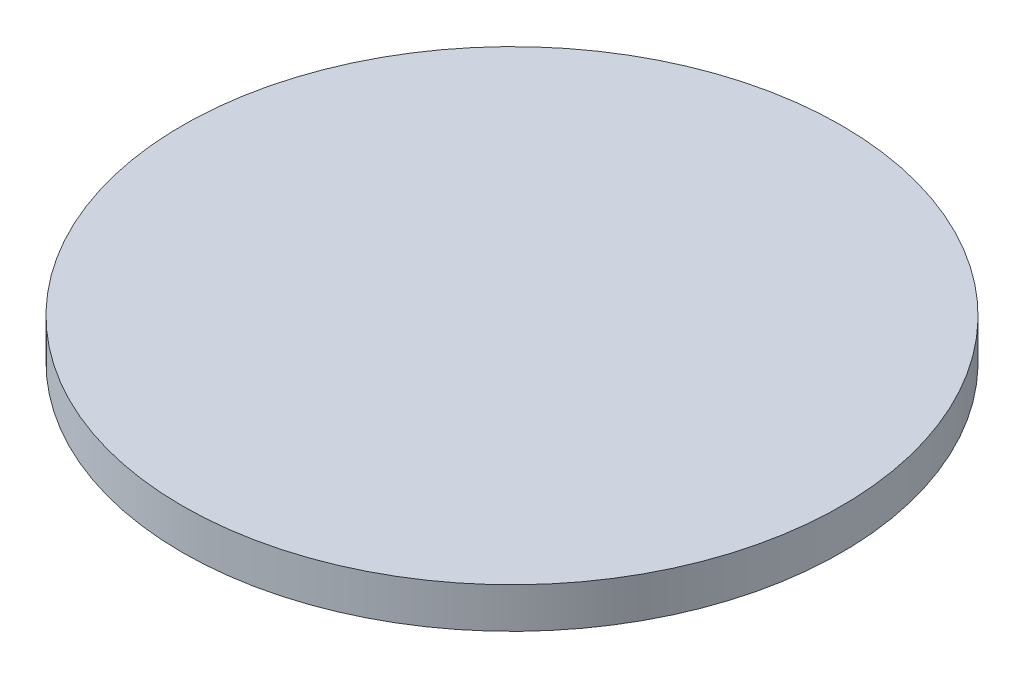
ISO-10303-21;
HEADER;
FILE_DESCRIPTION(('STEP AP214'),'2;1');
FILE_NAME('part.step','',(''),(''),'','','');
FILE_SCHEMA(('AUTOMOTIVE_DESIGN { 1 0 10303 214 1 1 1 1 }'));
ENDSEC;
DATA;
#1=APPLICATION_CONTEXT('core data for automotive mechanical design processes');
#2=APPLICATION_PROTOCOL_DEFINITION('international standard','automotive_design',2000,#1);
#3=PRODUCT_CONTEXT('',#1,'mechanical');
#4=PRODUCT('Part','Part','',(#3));
#5=PRODUCT_RELATED_PRODUCT_CATEGORY('part','',(#4));
#6=PRODUCT_DEFINITION_FORMATION('','',#4);
#7=PRODUCT_DEFINITION_CONTEXT('part definition',#1,'design');
#8=PRODUCT_DEFINITION('design','',#6,#7);
#9=PRODUCT_DEFINITION_SHAPE('','',#8);
#10=(LENGTH_UNIT() NAMED_UNIT(*) SI_UNIT(.MILLI.,.METRE.));
#11=(NAMED_UNIT(*) PLANE_ANGLE_UNIT() SI_UNIT($,.RADIAN.));
#12=(NAMED_UNIT(*) SI_UNIT($,.STERADIAN.) SOLID_ANGLE_UNIT());
#13=UNCERTAINTY_MEASURE_WITH_UNIT(LENGTH_MEASURE(1.E-05),#10,'distance_accuracy_value','');
#14=(GEOMETRIC_REPRESENTATION_CONTEXT(3) GLOBAL_UNCERTAINTY_ASSIGNED_CONTEXT((#13)) GLOBAL_UNIT_ASSIGNED_CONTEXT((#10,
#11,#12)) REPRESENTATION_CONTEXT('',''));
#15=CARTESIAN_POINT('',(0.,0.,0.));
#16=DIRECTION('',(0.,0.,1.));
#17=DIRECTION('',(1.,0.,0.));
#18=AXIS2_PLACEMENT_3D('',#15,#16,#17);
#19=CARTESIAN_POINT('',(0.,3.,0.));
#20=DIRECTION('',(0.,-1.,0.));
#21=DIRECTION('',(0.,0.,-1.));
#22=AXIS2_PLACEMENT_3D('',#19,#20,#21);
#23=CYLINDRICAL_SURFACE('',#22,24.4898774443049);
#24=CARTESIAN_POINT('',(0.,3.,0.));
#25=DIRECTION('',(0.,1.,0.));
#26=DIRECTION('',(0.,0.,1.));
#27=AXIS2_PLACEMENT_3D('',#24,#25,#26);
#28=CIRCLE('',#27,24.4898774443049);
#29=CARTESIAN_POINT('',(0.,3.,24.4898774443049));
#30=VERTEX_POINT('',#29);
#31=EDGE_CURVE('E10',#30,#30,#28,.T.);
#32=ORIENTED_EDGE('',*,*,#31,.F.);
#33=EDGE_LOOP('',(#32));
#34=FACE_BOUND('',#33,.T.);
#35=CARTESIAN_POINT('',(0.,0.,0.));
#36=DIRECTION('',(0.,1.,0.));
#37=DIRECTION('',(0.,0.,1.));
#38=AXIS2_PLACEMENT_3D('',#35,#36,#37);
#39=CIRCLE('',#38,24.4898774443049);
#40=CARTESIAN_POINT('',(0.,0.,24.4898774443049));
#41=VERTEX_POINT('',#40);
#42=EDGE_CURVE('E34',#41,#41,#39,.T.);
#43=ORIENTED_EDGE('',*,*,#42,.T.);
#44=EDGE_LOOP('',(#43));
#45=FACE_BOUND('',#44,.T.);
#46=ADVANCED_FACE('F31',(#34,#45),#23,.T.);
#47=CARTESIAN_POINT('',(0.,3.,0.));
#48=DIRECTION('',(0.,1.,0.));
#49=DIRECTION('',(0.,0.,1.));
#50=AXIS2_PLACEMENT_3D('',#47,#48,#49);
#51=PLANE('',#50);
#52=ORIENTED_EDGE('',*,*,#31,.T.);
#53=EDGE_LOOP('',(#52));
#54=FACE_BOUND('',#53,.T.);
#55=ADVANCED_FACE('F46',(#54),#51,.T.);
#56=CARTESIAN_POINT('',(0.,0.,0.));
#57=DIRECTION('',(0.,1.,0.));
#58=DIRECTION('',(0.,0.,1.));
#59=AXIS2_PLACEMENT_3D('',#56,#57,#58);
#60=PLANE('',#59);
#61=ORIENTED_EDGE('',*,*,#42,.F.);
#62=EDGE_LOOP('',(#61));
#63=FACE_BOUND('',#62,.T.);
#64=ADVANCED_FACE('F44',(#63),#60,.F.);
#65=CLOSED_SHELL('',(#46,#55,#64));
#66=MANIFOLD_SOLID_BREP('B2',#65);
#67=ADVANCED_BREP_SHAPE_REPRESENTATION('',(#18,#66),#14);
#68=SHAPE_DEFINITION_REPRESENTATION(#9,#67);
ENDSEC;
END-ISO-10303-21;
